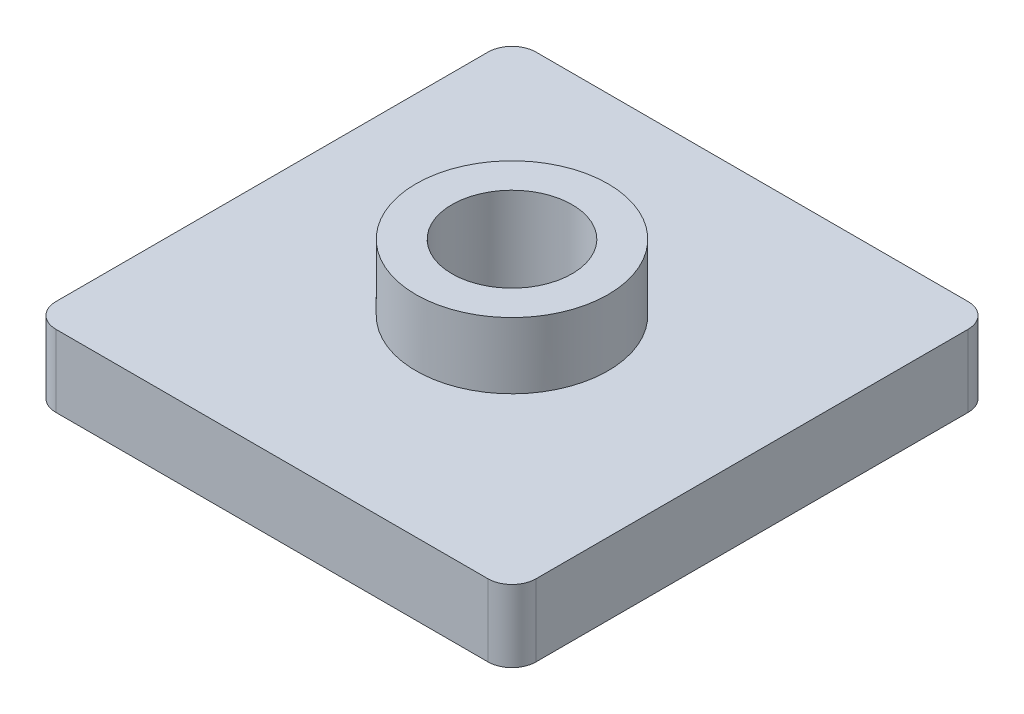
ISO-10303-21;
HEADER;
FILE_DESCRIPTION(('STEP AP214'),'2;1');
FILE_NAME('part.step','',(''),(''),'','','');
FILE_SCHEMA(('AUTOMOTIVE_DESIGN { 1 0 10303 214 1 1 1 1 }'));
ENDSEC;
DATA;
#1=APPLICATION_CONTEXT('core data for automotive mechanical design processes');
#2=APPLICATION_PROTOCOL_DEFINITION('international standard','automotive_design',2000,#1);
#3=PRODUCT_CONTEXT('',#1,'mechanical');
#4=PRODUCT('Part','Part','',(#3));
#5=PRODUCT_RELATED_PRODUCT_CATEGORY('part','',(#4));
#6=PRODUCT_DEFINITION_FORMATION('','',#4);
#7=PRODUCT_DEFINITION_CONTEXT('part definition',#1,'design');
#8=PRODUCT_DEFINITION('design','',#6,#7);
#9=PRODUCT_DEFINITION_SHAPE('','',#8);
#10=(LENGTH_UNIT() NAMED_UNIT(*) SI_UNIT(.MILLI.,.METRE.));
#11=(NAMED_UNIT(*) PLANE_ANGLE_UNIT() SI_UNIT($,.RADIAN.));
#12=(NAMED_UNIT(*) SI_UNIT($,.STERADIAN.) SOLID_ANGLE_UNIT());
#13=UNCERTAINTY_MEASURE_WITH_UNIT(LENGTH_MEASURE(1.E-05),#10,'distance_accuracy_value','');
#14=(GEOMETRIC_REPRESENTATION_CONTEXT(3) GLOBAL_UNCERTAINTY_ASSIGNED_CONTEXT((#13)) GLOBAL_UNIT_ASSIGNED_CONTEXT((#10,
#11,#12)) REPRESENTATION_CONTEXT('',''));
#15=CARTESIAN_POINT('',(0.,0.,0.));
#16=DIRECTION('',(0.,0.,1.));
#17=DIRECTION('',(1.,0.,0.));
#18=AXIS2_PLACEMENT_3D('',#15,#16,#17);
#19=CARTESIAN_POINT('',(-9.99999999999991,3.,-9.99999999999998));
#20=DIRECTION('',(0.,0.,-1.));
#21=DIRECTION('',(-1.,0.,0.));
#22=AXIS2_PLACEMENT_3D('',#19,#20,#21);
#23=PLANE('',#22);
#24=DIRECTION('',(1.,0.,0.));
#25=VECTOR('',#24,1.);
#26=CARTESIAN_POINT('',(-9.99999999999991,0.,-9.99999999999998));
#27=LINE('',#26,#25);
#28=CARTESIAN_POINT('',(-8.99999999999991,0.,-9.99999999999998));
#29=VERTEX_POINT('',#28);
#30=CARTESIAN_POINT('',(9.0000000000001,0.,-9.99999999999998));
#31=VERTEX_POINT('',#30);
#32=EDGE_CURVE('E179',#29,#31,#27,.T.);
#33=ORIENTED_EDGE('',*,*,#32,.F.);
#34=DIRECTION('',(0.,-1.,0.));
#35=VECTOR('',#34,1.);
#36=CARTESIAN_POINT('',(-8.99999999999991,3.,-9.99999999999998));
#37=LINE('',#36,#35);
#38=CARTESIAN_POINT('',(-8.99999999999991,3.,-9.99999999999998));
#39=VERTEX_POINT('',#38);
#40=EDGE_CURVE('E112',#29,#39,#37,.F.);
#41=ORIENTED_EDGE('',*,*,#40,.T.);
#42=DIRECTION('',(1.,0.,0.));
#43=VECTOR('',#42,1.);
#44=CARTESIAN_POINT('',(-9.99999999999991,3.,-9.99999999999998));
#45=LINE('',#44,#43);
#46=CARTESIAN_POINT('',(9.0000000000001,3.,-9.99999999999998));
#47=VERTEX_POINT('',#46);
#48=EDGE_CURVE('E133',#39,#47,#45,.T.);
#49=ORIENTED_EDGE('',*,*,#48,.T.);
#50=DIRECTION('',(0.,-1.,0.));
#51=VECTOR('',#50,1.);
#52=CARTESIAN_POINT('',(9.0000000000001,3.,-9.99999999999998));
#53=LINE('',#52,#51);
#54=EDGE_CURVE('E117',#47,#31,#53,.T.);
#55=ORIENTED_EDGE('',*,*,#54,.T.);
#56=EDGE_LOOP('',(#33,#41,#49,#55));
#57=FACE_BOUND('',#56,.T.);
#58=ADVANCED_FACE('F39',(#57),#23,.T.);
#59=CARTESIAN_POINT('',(-9.99999999999991,3.,-9.99999999999998));
#60=DIRECTION('',(1.,0.,0.));
#61=DIRECTION('',(0.,0.,-1.));
#62=AXIS2_PLACEMENT_3D('',#59,#60,#61);
#63=PLANE('',#62);
#64=DIRECTION('',(0.,0.,1.));
#65=VECTOR('',#64,1.);
#66=CARTESIAN_POINT('',(-9.99999999999991,3.,-9.99999999999998));
#67=LINE('',#66,#65);
#68=CARTESIAN_POINT('',(-9.99999999999991,3.,-8.99999999999998));
#69=VERTEX_POINT('',#68);
#70=CARTESIAN_POINT('',(-9.9999999999999,3.,9.00000000000004));
#71=VERTEX_POINT('',#70);
#72=EDGE_CURVE('E127',#69,#71,#67,.T.);
#73=ORIENTED_EDGE('',*,*,#72,.F.);
#74=DIRECTION('',(0.,-1.,0.));
#75=VECTOR('',#74,1.);
#76=CARTESIAN_POINT('',(-9.99999999999991,0.,-8.99999999999998));
#77=LINE('',#76,#75);
#78=CARTESIAN_POINT('',(-9.99999999999991,0.,-8.99999999999998));
#79=VERTEX_POINT('',#78);
#80=EDGE_CURVE('E111',#69,#79,#77,.T.);
#81=ORIENTED_EDGE('',*,*,#80,.T.);
#82=DIRECTION('',(0.,0.,1.));
#83=VECTOR('',#82,1.);
#84=CARTESIAN_POINT('',(-9.99999999999991,0.,-9.99999999999998));
#85=LINE('',#84,#83);
#86=CARTESIAN_POINT('',(-9.9999999999999,0.,9.00000000000004));
#87=VERTEX_POINT('',#86);
#88=EDGE_CURVE('E124',#79,#87,#85,.T.);
#89=ORIENTED_EDGE('',*,*,#88,.T.);
#90=DIRECTION('',(0.,-1.,0.));
#91=VECTOR('',#90,1.);
#92=CARTESIAN_POINT('',(-9.9999999999999,3.,9.00000000000004));
#93=LINE('',#92,#91);
#94=EDGE_CURVE('E129',#87,#71,#93,.F.);
#95=ORIENTED_EDGE('',*,*,#94,.T.);
#96=EDGE_LOOP('',(#73,#81,#89,#95));
#97=FACE_BOUND('',#96,.T.);
#98=ADVANCED_FACE('F123',(#97),#63,.F.);
#99=CARTESIAN_POINT('',(-9.9999999999999,3.,10.));
#100=DIRECTION('',(0.,0.,-1.));
#101=DIRECTION('',(-1.,0.,0.));
#102=AXIS2_PLACEMENT_3D('',#99,#100,#101);
#103=PLANE('',#102);
#104=DIRECTION('',(1.,0.,0.));
#105=VECTOR('',#104,1.);
#106=CARTESIAN_POINT('',(-9.9999999999999,0.,10.));
#107=LINE('',#106,#105);
#108=CARTESIAN_POINT('',(-8.99999999999991,0.,10.));
#109=VERTEX_POINT('',#108);
#110=CARTESIAN_POINT('',(9.0000000000001,0.,10.));
#111=VERTEX_POINT('',#110);
#112=EDGE_CURVE('E134',#109,#111,#107,.T.);
#113=ORIENTED_EDGE('',*,*,#112,.T.);
#114=DIRECTION('',(0.,-1.,0.));
#115=VECTOR('',#114,1.);
#116=CARTESIAN_POINT('',(9.0000000000001,3.,10.));
#117=LINE('',#116,#115);
#118=CARTESIAN_POINT('',(9.0000000000001,3.,10.));
#119=VERTEX_POINT('',#118);
#120=EDGE_CURVE('E43',#111,#119,#117,.F.);
#121=ORIENTED_EDGE('',*,*,#120,.T.);
#122=DIRECTION('',(1.,0.,0.));
#123=VECTOR('',#122,1.);
#124=CARTESIAN_POINT('',(-9.9999999999999,3.,10.));
#125=LINE('',#124,#123);
#126=CARTESIAN_POINT('',(-8.99999999999991,3.,10.));
#127=VERTEX_POINT('',#126);
#128=EDGE_CURVE('E169',#127,#119,#125,.T.);
#129=ORIENTED_EDGE('',*,*,#128,.F.);
#130=DIRECTION('',(0.,-1.,0.));
#131=VECTOR('',#130,1.);
#132=CARTESIAN_POINT('',(-8.99999999999991,3.,10.));
#133=LINE('',#132,#131);
#134=EDGE_CURVE('E162',#127,#109,#133,.T.);
#135=ORIENTED_EDGE('',*,*,#134,.T.);
#136=EDGE_LOOP('',(#113,#121,#129,#135));
#137=FACE_BOUND('',#136,.T.);
#138=ADVANCED_FACE('F168',(#137),#103,.F.);
#139=CARTESIAN_POINT('',(10.0000000000001,3.,-9.99999999999998));
#140=DIRECTION('',(1.,0.,0.));
#141=DIRECTION('',(0.,0.,-1.));
#142=AXIS2_PLACEMENT_3D('',#139,#140,#141);
#143=PLANE('',#142);
#144=DIRECTION('',(0.,0.,1.));
#145=VECTOR('',#144,1.);
#146=CARTESIAN_POINT('',(10.0000000000001,0.,-9.99999999999998));
#147=LINE('',#146,#145);
#148=CARTESIAN_POINT('',(10.0000000000001,0.,-8.99999999999998));
#149=VERTEX_POINT('',#148);
#150=CARTESIAN_POINT('',(10.0000000000001,0.,9.00000000000004));
#151=VERTEX_POINT('',#150);
#152=EDGE_CURVE('E140',#149,#151,#147,.T.);
#153=ORIENTED_EDGE('',*,*,#152,.F.);
#154=DIRECTION('',(0.,-1.,0.));
#155=VECTOR('',#154,1.);
#156=CARTESIAN_POINT('',(10.0000000000001,3.,-8.99999999999998));
#157=LINE('',#156,#155);
#158=CARTESIAN_POINT('',(10.0000000000001,3.,-8.99999999999998));
#159=VERTEX_POINT('',#158);
#160=EDGE_CURVE('E62',#149,#159,#157,.F.);
#161=ORIENTED_EDGE('',*,*,#160,.T.);
#162=DIRECTION('',(0.,0.,1.));
#163=VECTOR('',#162,1.);
#164=CARTESIAN_POINT('',(10.0000000000001,3.,-9.99999999999998));
#165=LINE('',#164,#163);
#166=CARTESIAN_POINT('',(10.0000000000001,3.,9.00000000000004));
#167=VERTEX_POINT('',#166);
#168=EDGE_CURVE('E137',#159,#167,#165,.T.);
#169=ORIENTED_EDGE('',*,*,#168,.T.);
#170=DIRECTION('',(0.,-1.,0.));
#171=VECTOR('',#170,1.);
#172=CARTESIAN_POINT('',(10.0000000000001,0.,9.00000000000004));
#173=LINE('',#172,#171);
#174=EDGE_CURVE('E159',#167,#151,#173,.T.);
#175=ORIENTED_EDGE('',*,*,#174,.T.);
#176=EDGE_LOOP('',(#153,#161,#169,#175));
#177=FACE_BOUND('',#176,.T.);
#178=ADVANCED_FACE('F178',(#177),#143,.T.);
#179=CARTESIAN_POINT('',(0.,3.,0.));
#180=DIRECTION('',(0.,-1.,0.));
#181=DIRECTION('',(0.,0.,-1.));
#182=AXIS2_PLACEMENT_3D('',#179,#180,#181);
#183=PLANE('',#182);
#184=CARTESIAN_POINT('',(0.,3.,0.));
#185=DIRECTION('',(0.,-1.,0.));
#186=DIRECTION('',(0.,0.,-1.));
#187=AXIS2_PLACEMENT_3D('',#184,#185,#186);
#188=CIRCLE('',#187,4.);
#189=CARTESIAN_POINT('',(0.,3.,-3.99999999999997));
#190=VERTEX_POINT('',#189);
#191=EDGE_CURVE('E11',#190,#190,#188,.F.);
#192=ORIENTED_EDGE('',*,*,#191,.F.);
#193=EDGE_LOOP('',(#192));
#194=FACE_BOUND('',#193,.T.);
#195=ORIENTED_EDGE('',*,*,#48,.F.);
#196=CARTESIAN_POINT('',(-8.99999999999991,3.,-8.99999999999998));
#197=DIRECTION('',(0.,-1.,0.));
#198=DIRECTION('',(0.,0.,-1.));
#199=AXIS2_PLACEMENT_3D('',#196,#197,#198);
#200=CIRCLE('',#199,1.);
#201=EDGE_CURVE('E157',#39,#69,#200,.F.);
#202=ORIENTED_EDGE('',*,*,#201,.T.);
#203=ORIENTED_EDGE('',*,*,#72,.T.);
#204=CARTESIAN_POINT('',(-8.99999999999991,3.,9.00000000000004));
#205=DIRECTION('',(0.,-1.,0.));
#206=DIRECTION('',(0.,0.,-1.));
#207=AXIS2_PLACEMENT_3D('',#204,#205,#206);
#208=CIRCLE('',#207,1.);
#209=EDGE_CURVE('E152',#71,#127,#208,.F.);
#210=ORIENTED_EDGE('',*,*,#209,.T.);
#211=ORIENTED_EDGE('',*,*,#128,.T.);
#212=CARTESIAN_POINT('',(9.0000000000001,3.,9.00000000000004));
#213=DIRECTION('',(0.,-1.,0.));
#214=DIRECTION('',(0.,0.,-1.));
#215=AXIS2_PLACEMENT_3D('',#212,#213,#214);
#216=CIRCLE('',#215,1.);
#217=EDGE_CURVE('E55',#119,#167,#216,.F.);
#218=ORIENTED_EDGE('',*,*,#217,.T.);
#219=ORIENTED_EDGE('',*,*,#168,.F.);
#220=CARTESIAN_POINT('',(9.0000000000001,3.,-8.99999999999998));
#221=DIRECTION('',(0.,-1.,0.));
#222=DIRECTION('',(0.,0.,-1.));
#223=AXIS2_PLACEMENT_3D('',#220,#221,#222);
#224=CIRCLE('',#223,1.);
#225=EDGE_CURVE('E155',#159,#47,#224,.F.);
#226=ORIENTED_EDGE('',*,*,#225,.T.);
#227=EDGE_LOOP('',(#195,#202,#203,#210,#211,#218,#219,#226));
#228=FACE_BOUND('',#227,.T.);
#229=ADVANCED_FACE('F172',(#194,#228),#183,.F.);
#230=CARTESIAN_POINT('',(0.,0.,0.));
#231=DIRECTION('',(0.,-1.,0.));
#232=DIRECTION('',(0.,0.,-1.));
#233=AXIS2_PLACEMENT_3D('',#230,#231,#232);
#234=PLANE('',#233);
#235=CARTESIAN_POINT('',(0.,0.,0.));
#236=DIRECTION('',(0.,-1.,0.));
#237=DIRECTION('',(0.,0.,-1.));
#238=AXIS2_PLACEMENT_3D('',#235,#236,#237);
#239=CIRCLE('',#238,2.5);
#240=CARTESIAN_POINT('',(0.,0.,-2.5));
#241=VERTEX_POINT('',#240);
#242=EDGE_CURVE('E187',#241,#241,#239,.F.);
#243=ORIENTED_EDGE('',*,*,#242,.T.);
#244=EDGE_LOOP('',(#243));
#245=FACE_BOUND('',#244,.T.);
#246=ORIENTED_EDGE('',*,*,#88,.F.);
#247=CARTESIAN_POINT('',(-8.99999999999991,0.,-8.99999999999998));
#248=DIRECTION('',(0.,-1.,0.));
#249=DIRECTION('',(0.,0.,-1.));
#250=AXIS2_PLACEMENT_3D('',#247,#248,#249);
#251=CIRCLE('',#250,1.);
#252=EDGE_CURVE('E107',#79,#29,#251,.T.);
#253=ORIENTED_EDGE('',*,*,#252,.T.);
#254=ORIENTED_EDGE('',*,*,#32,.T.);
#255=CARTESIAN_POINT('',(9.0000000000001,0.,-8.99999999999998));
#256=DIRECTION('',(0.,-1.,0.));
#257=DIRECTION('',(0.,0.,-1.));
#258=AXIS2_PLACEMENT_3D('',#255,#256,#257);
#259=CIRCLE('',#258,1.);
#260=EDGE_CURVE('E118',#31,#149,#259,.T.);
#261=ORIENTED_EDGE('',*,*,#260,.T.);
#262=ORIENTED_EDGE('',*,*,#152,.T.);
#263=CARTESIAN_POINT('',(9.0000000000001,0.,9.00000000000004));
#264=DIRECTION('',(0.,-1.,0.));
#265=DIRECTION('',(0.,0.,-1.));
#266=AXIS2_PLACEMENT_3D('',#263,#264,#265);
#267=CIRCLE('',#266,1.);
#268=EDGE_CURVE('E146',#151,#111,#267,.T.);
#269=ORIENTED_EDGE('',*,*,#268,.T.);
#270=ORIENTED_EDGE('',*,*,#112,.F.);
#271=CARTESIAN_POINT('',(-8.99999999999991,0.,9.00000000000004));
#272=DIRECTION('',(0.,-1.,0.));
#273=DIRECTION('',(0.,0.,-1.));
#274=AXIS2_PLACEMENT_3D('',#271,#272,#273);
#275=CIRCLE('',#274,1.);
#276=EDGE_CURVE('E128',#109,#87,#275,.T.);
#277=ORIENTED_EDGE('',*,*,#276,.T.);
#278=EDGE_LOOP('',(#246,#253,#254,#261,#262,#269,#270,#277));
#279=FACE_BOUND('',#278,.T.);
#280=ADVANCED_FACE('F131',(#245,#279),#234,.T.);
#281=CARTESIAN_POINT('',(-8.99999999999991,3.,-8.99999999999998));
#282=DIRECTION('',(0.,1.,0.));
#283=DIRECTION('',(0.,0.,1.));
#284=AXIS2_PLACEMENT_3D('',#281,#282,#283);
#285=CYLINDRICAL_SURFACE('',#284,1.);
#286=ORIENTED_EDGE('',*,*,#201,.F.);
#287=ORIENTED_EDGE('',*,*,#40,.F.);
#288=ORIENTED_EDGE('',*,*,#252,.F.);
#289=ORIENTED_EDGE('',*,*,#80,.F.);
#290=EDGE_LOOP('',(#286,#287,#288,#289));
#291=FACE_BOUND('',#290,.T.);
#292=ADVANCED_FACE('F110',(#291),#285,.T.);
#293=CARTESIAN_POINT('',(9.0000000000001,3.,-8.99999999999998));
#294=DIRECTION('',(0.,-1.,0.));
#295=DIRECTION('',(0.,0.,-1.));
#296=AXIS2_PLACEMENT_3D('',#293,#294,#295);
#297=CYLINDRICAL_SURFACE('',#296,1.);
#298=ORIENTED_EDGE('',*,*,#225,.F.);
#299=ORIENTED_EDGE('',*,*,#160,.F.);
#300=ORIENTED_EDGE('',*,*,#260,.F.);
#301=ORIENTED_EDGE('',*,*,#54,.F.);
#302=EDGE_LOOP('',(#298,#299,#300,#301));
#303=FACE_BOUND('',#302,.T.);
#304=ADVANCED_FACE('F229',(#303),#297,.T.);
#305=CARTESIAN_POINT('',(9.0000000000001,3.,9.00000000000004));
#306=DIRECTION('',(0.,1.,0.));
#307=DIRECTION('',(0.,0.,1.));
#308=AXIS2_PLACEMENT_3D('',#305,#306,#307);
#309=CYLINDRICAL_SURFACE('',#308,1.);
#310=ORIENTED_EDGE('',*,*,#217,.F.);
#311=ORIENTED_EDGE('',*,*,#120,.F.);
#312=ORIENTED_EDGE('',*,*,#268,.F.);
#313=ORIENTED_EDGE('',*,*,#174,.F.);
#314=EDGE_LOOP('',(#310,#311,#312,#313));
#315=FACE_BOUND('',#314,.T.);
#316=ADVANCED_FACE('F176',(#315),#309,.T.);
#317=CARTESIAN_POINT('',(-8.99999999999991,3.,9.00000000000004));
#318=DIRECTION('',(0.,-1.,0.));
#319=DIRECTION('',(0.,0.,-1.));
#320=AXIS2_PLACEMENT_3D('',#317,#318,#319);
#321=CYLINDRICAL_SURFACE('',#320,1.);
#322=ORIENTED_EDGE('',*,*,#209,.F.);
#323=ORIENTED_EDGE('',*,*,#94,.F.);
#324=ORIENTED_EDGE('',*,*,#276,.F.);
#325=ORIENTED_EDGE('',*,*,#134,.F.);
#326=EDGE_LOOP('',(#322,#323,#324,#325));
#327=FACE_BOUND('',#326,.T.);
#328=ADVANCED_FACE('F41',(#327),#321,.T.);
#329=CARTESIAN_POINT('',(0.,5.75,0.));
#330=DIRECTION('',(0.,-1.,0.));
#331=DIRECTION('',(0.,0.,-1.));
#332=AXIS2_PLACEMENT_3D('',#329,#330,#331);
#333=CYLINDRICAL_SURFACE('',#332,4.);
#334=CARTESIAN_POINT('',(0.,5.75,0.));
#335=DIRECTION('',(0.,1.,0.));
#336=DIRECTION('',(0.,0.,1.));
#337=AXIS2_PLACEMENT_3D('',#334,#335,#336);
#338=CIRCLE('',#337,4.);
#339=CARTESIAN_POINT('',(0.,5.75,4.00000000000003));
#340=VERTEX_POINT('',#339);
#341=EDGE_CURVE('E180',#340,#340,#338,.T.);
#342=ORIENTED_EDGE('',*,*,#341,.F.);
#343=EDGE_LOOP('',(#342));
#344=FACE_BOUND('',#343,.T.);
#345=ORIENTED_EDGE('',*,*,#191,.T.);
#346=EDGE_LOOP('',(#345));
#347=FACE_BOUND('',#346,.T.);
#348=ADVANCED_FACE('F200',(#344,#347),#333,.T.);
#349=CARTESIAN_POINT('',(0.,5.75,0.));
#350=DIRECTION('',(0.,1.,0.));
#351=DIRECTION('',(0.,0.,1.));
#352=AXIS2_PLACEMENT_3D('',#349,#350,#351);
#353=PLANE('',#352);
#354=CARTESIAN_POINT('',(0.,5.75,0.));
#355=DIRECTION('',(0.,1.,0.));
#356=DIRECTION('',(0.,0.,1.));
#357=AXIS2_PLACEMENT_3D('',#354,#355,#356);
#358=CIRCLE('',#357,2.5);
#359=CARTESIAN_POINT('',(0.,5.75,2.5));
#360=VERTEX_POINT('',#359);
#361=EDGE_CURVE('E190',#360,#360,#358,.T.);
#362=ORIENTED_EDGE('',*,*,#361,.F.);
#363=EDGE_LOOP('',(#362));
#364=FACE_BOUND('',#363,.T.);
#365=ORIENTED_EDGE('',*,*,#341,.T.);
#366=EDGE_LOOP('',(#365));
#367=FACE_BOUND('',#366,.T.);
#368=ADVANCED_FACE('F197',(#364,#367),#353,.T.);
#369=CARTESIAN_POINT('',(0.,-7.07106781186547,0.));
#370=DIRECTION('',(0.,1.,0.));
#371=DIRECTION('',(0.,0.,1.));
#372=AXIS2_PLACEMENT_3D('',#369,#370,#371);
#373=CYLINDRICAL_SURFACE('',#372,2.5);
#374=ORIENTED_EDGE('',*,*,#361,.T.);
#375=EDGE_LOOP('',(#374));
#376=FACE_BOUND('',#375,.T.);
#377=ORIENTED_EDGE('',*,*,#242,.F.);
#378=EDGE_LOOP('',(#377));
#379=FACE_BOUND('',#378,.T.);
#380=ADVANCED_FACE('F194',(#376,#379),#373,.F.);
#381=CLOSED_SHELL('',(#58,#98,#138,#178,#229,#280,#292,#304,#316,#328,#348,#368,#380));
#382=MANIFOLD_SOLID_BREP('B2',#381);
#383=ADVANCED_BREP_SHAPE_REPRESENTATION('',(#18,#382),#14);
#384=SHAPE_DEFINITION_REPRESENTATION(#9,#383);
ENDSEC;
END-ISO-10303-21;
